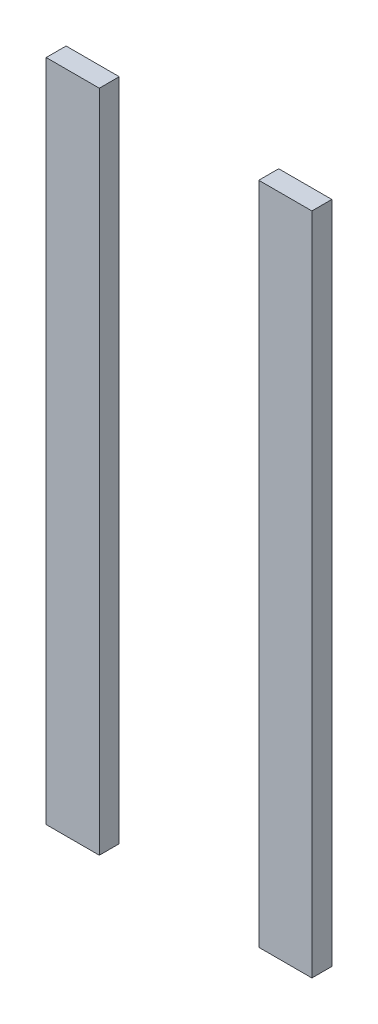
ISO-10303-21;
HEADER;
FILE_DESCRIPTION(('STEP AP214'),'2;1');
FILE_NAME('part.step','',(''),(''),'','','');
FILE_SCHEMA(('AUTOMOTIVE_DESIGN { 1 0 10303 214 1 1 1 1 }'));
ENDSEC;
DATA;
#1=APPLICATION_CONTEXT('core data for automotive mechanical design processes');
#2=APPLICATION_PROTOCOL_DEFINITION('international standard','automotive_design',2000,#1);
#3=PRODUCT_CONTEXT('',#1,'mechanical');
#4=PRODUCT('Part','Part','',(#3));
#5=PRODUCT_RELATED_PRODUCT_CATEGORY('part','',(#4));
#6=PRODUCT_DEFINITION_FORMATION('','',#4);
#7=PRODUCT_DEFINITION_CONTEXT('part definition',#1,'design');
#8=PRODUCT_DEFINITION('design','',#6,#7);
#9=PRODUCT_DEFINITION_SHAPE('','',#8);
#10=(LENGTH_UNIT() NAMED_UNIT(*) SI_UNIT(.MILLI.,.METRE.));
#11=(NAMED_UNIT(*) PLANE_ANGLE_UNIT() SI_UNIT($,.RADIAN.));
#12=(NAMED_UNIT(*) SI_UNIT($,.STERADIAN.) SOLID_ANGLE_UNIT());
#13=UNCERTAINTY_MEASURE_WITH_UNIT(LENGTH_MEASURE(1.E-05),#10,'distance_accuracy_value','');
#14=(GEOMETRIC_REPRESENTATION_CONTEXT(3) GLOBAL_UNCERTAINTY_ASSIGNED_CONTEXT((#13)) GLOBAL_UNIT_ASSIGNED_CONTEXT((#10,
#11,#12)) REPRESENTATION_CONTEXT('',''));
#15=CARTESIAN_POINT('',(0.,0.,0.));
#16=DIRECTION('',(0.,0.,1.));
#17=DIRECTION('',(1.,0.,0.));
#18=AXIS2_PLACEMENT_3D('',#15,#16,#17);
#19=CARTESIAN_POINT('',(0.,119.000004090112,0.));
#20=DIRECTION('',(0.,1.,0.));
#21=DIRECTION('',(0.,0.,-1.));
#22=AXIS2_PLACEMENT_3D('',#19,#20,#21);
#23=PLANE('',#22);
#24=DIRECTION('',(1.,0.,0.));
#25=VECTOR('',#24,1.);
#26=CARTESIAN_POINT('',(-20.,119.000004090112,-1.5));
#27=LINE('',#26,#25);
#28=CARTESIAN_POINT('',(-20.,119.000004090112,-1.5));
#29=VERTEX_POINT('',#28);
#30=CARTESIAN_POINT('',(-12.,119.000004090112,-1.5));
#31=VERTEX_POINT('',#30);
#32=EDGE_CURVE('E127',#29,#31,#27,.T.);
#33=ORIENTED_EDGE('',*,*,#32,.T.);
#34=DIRECTION('',(0.,0.,1.));
#35=VECTOR('',#34,1.);
#36=CARTESIAN_POINT('',(-12.,119.000004090112,-8.49999999999999));
#37=LINE('',#36,#35);
#38=CARTESIAN_POINT('',(-12.,119.000004090112,1.50000000000001));
#39=VERTEX_POINT('',#38);
#40=EDGE_CURVE('E75',#31,#39,#37,.T.);
#41=ORIENTED_EDGE('',*,*,#40,.T.);
#42=DIRECTION('',(-1.,0.,0.));
#43=VECTOR('',#42,1.);
#44=CARTESIAN_POINT('',(20.,119.000004090112,1.5));
#45=LINE('',#44,#43);
#46=CARTESIAN_POINT('',(-20.,119.000004090112,1.5));
#47=VERTEX_POINT('',#46);
#48=EDGE_CURVE('E63',#39,#47,#45,.T.);
#49=ORIENTED_EDGE('',*,*,#48,.T.);
#50=DIRECTION('',(0.,0.,-1.));
#51=VECTOR('',#50,1.);
#52=CARTESIAN_POINT('',(-20.,119.000004090112,1.5));
#53=LINE('',#52,#51);
#54=EDGE_CURVE('E132',#47,#29,#53,.T.);
#55=ORIENTED_EDGE('',*,*,#54,.T.);
#56=EDGE_LOOP('',(#33,#41,#49,#55));
#57=FACE_BOUND('',#56,.T.);
#58=ADVANCED_FACE('F60',(#57),#23,.F.);
#59=CARTESIAN_POINT('',(0.,219.000011994922,0.));
#60=DIRECTION('',(0.,1.,0.));
#61=DIRECTION('',(0.,0.,-1.));
#62=AXIS2_PLACEMENT_3D('',#59,#60,#61);
#63=PLANE('',#62);
#64=DIRECTION('',(0.,0.,1.));
#65=VECTOR('',#64,1.);
#66=CARTESIAN_POINT('',(-12.,219.000011994922,-8.49999999999999));
#67=LINE('',#66,#65);
#68=CARTESIAN_POINT('',(-12.,219.000011994922,-1.50000000000001));
#69=VERTEX_POINT('',#68);
#70=CARTESIAN_POINT('',(-12.,219.000011994922,1.5));
#71=VERTEX_POINT('',#70);
#72=EDGE_CURVE('E69',#69,#71,#67,.T.);
#73=ORIENTED_EDGE('',*,*,#72,.F.);
#74=DIRECTION('',(-1.,0.,0.));
#75=VECTOR('',#74,1.);
#76=CARTESIAN_POINT('',(-20.,219.000011994922,-1.5));
#77=LINE('',#76,#75);
#78=CARTESIAN_POINT('',(-20.,219.000011994922,-1.5));
#79=VERTEX_POINT('',#78);
#80=EDGE_CURVE('E124',#69,#79,#77,.T.);
#81=ORIENTED_EDGE('',*,*,#80,.T.);
#82=DIRECTION('',(0.,0.,1.));
#83=VECTOR('',#82,1.);
#84=CARTESIAN_POINT('',(-20.,219.000011994922,1.5));
#85=LINE('',#84,#83);
#86=CARTESIAN_POINT('',(-20.,219.000011994922,1.5));
#87=VERTEX_POINT('',#86);
#88=EDGE_CURVE('E114',#79,#87,#85,.T.);
#89=ORIENTED_EDGE('',*,*,#88,.T.);
#90=DIRECTION('',(1.,0.,0.));
#91=VECTOR('',#90,1.);
#92=CARTESIAN_POINT('',(20.,219.000011994922,1.5));
#93=LINE('',#92,#91);
#94=EDGE_CURVE('E111',#87,#71,#93,.T.);
#95=ORIENTED_EDGE('',*,*,#94,.T.);
#96=EDGE_LOOP('',(#73,#81,#89,#95));
#97=FACE_BOUND('',#96,.T.);
#98=ADVANCED_FACE('F112',(#97),#63,.T.);
#99=CARTESIAN_POINT('',(20.,119.000004090112,-1.5));
#100=DIRECTION('',(0.,0.,-1.));
#101=DIRECTION('',(0.,-1.,0.));
#102=AXIS2_PLACEMENT_3D('',#99,#100,#101);
#103=PLANE('',#102);
#104=DIRECTION('',(0.,1.,0.));
#105=VECTOR('',#104,1.);
#106=CARTESIAN_POINT('',(-12.,119.000004090112,-1.5));
#107=LINE('',#106,#105);
#108=EDGE_CURVE('E101',#31,#69,#107,.T.);
#109=ORIENTED_EDGE('',*,*,#108,.F.);
#110=ORIENTED_EDGE('',*,*,#32,.F.);
#111=DIRECTION('',(0.,1.,0.));
#112=VECTOR('',#111,1.);
#113=CARTESIAN_POINT('',(-20.,119.000004090112,-1.5));
#114=LINE('',#113,#112);
#115=EDGE_CURVE('E117',#29,#79,#114,.T.);
#116=ORIENTED_EDGE('',*,*,#115,.T.);
#117=ORIENTED_EDGE('',*,*,#80,.F.);
#118=EDGE_LOOP('',(#109,#110,#116,#117));
#119=FACE_BOUND('',#118,.T.);
#120=ADVANCED_FACE('F175',(#119),#103,.T.);
#121=CARTESIAN_POINT('',(-20.,119.000004090112,1.5));
#122=DIRECTION('',(0.,0.,1.));
#123=DIRECTION('',(0.,-1.,0.));
#124=AXIS2_PLACEMENT_3D('',#121,#122,#123);
#125=PLANE('',#124);
#126=DIRECTION('',(0.,-1.,0.));
#127=VECTOR('',#126,1.);
#128=CARTESIAN_POINT('',(-12.,119.000004090112,1.50000000000001));
#129=LINE('',#128,#127);
#130=EDGE_CURVE('E12',#71,#39,#129,.T.);
#131=ORIENTED_EDGE('',*,*,#130,.F.);
#132=ORIENTED_EDGE('',*,*,#94,.F.);
#133=DIRECTION('',(0.,1.,0.));
#134=VECTOR('',#133,1.);
#135=CARTESIAN_POINT('',(-20.,119.000004090112,1.5));
#136=LINE('',#135,#134);
#137=EDGE_CURVE('E122',#47,#87,#136,.T.);
#138=ORIENTED_EDGE('',*,*,#137,.F.);
#139=ORIENTED_EDGE('',*,*,#48,.F.);
#140=EDGE_LOOP('',(#131,#132,#138,#139));
#141=FACE_BOUND('',#140,.T.);
#142=ADVANCED_FACE('F109',(#141),#125,.T.);
#143=CARTESIAN_POINT('',(-20.,119.000004090112,-1.5));
#144=DIRECTION('',(-1.,0.,0.));
#145=DIRECTION('',(0.,1.,0.));
#146=AXIS2_PLACEMENT_3D('',#143,#144,#145);
#147=PLANE('',#146);
#148=ORIENTED_EDGE('',*,*,#54,.F.);
#149=ORIENTED_EDGE('',*,*,#137,.T.);
#150=ORIENTED_EDGE('',*,*,#88,.F.);
#151=ORIENTED_EDGE('',*,*,#115,.F.);
#152=EDGE_LOOP('',(#148,#149,#150,#151));
#153=FACE_BOUND('',#152,.T.);
#154=ADVANCED_FACE('F143',(#153),#147,.T.);
#155=CARTESIAN_POINT('',(-12.,119.000004090112,-8.49999999999999));
#156=DIRECTION('',(-1.,0.,0.));
#157=DIRECTION('',(0.,0.,1.));
#158=AXIS2_PLACEMENT_3D('',#155,#156,#157);
#159=PLANE('',#158);
#160=ORIENTED_EDGE('',*,*,#108,.T.);
#161=ORIENTED_EDGE('',*,*,#72,.T.);
#162=ORIENTED_EDGE('',*,*,#130,.T.);
#163=ORIENTED_EDGE('',*,*,#40,.F.);
#164=EDGE_LOOP('',(#160,#161,#162,#163));
#165=FACE_BOUND('',#164,.T.);
#166=ADVANCED_FACE('F100',(#165),#159,.F.);
#167=CLOSED_SHELL('',(#58,#98,#120,#142,#154,#166));
#168=MANIFOLD_SOLID_BREP('B2',#167);
#169=CARTESIAN_POINT('',(20.,119.000004090112,1.5));
#170=DIRECTION('',(1.,0.,0.));
#171=DIRECTION('',(0.,0.,-1.));
#172=AXIS2_PLACEMENT_3D('',#169,#170,#171);
#173=PLANE('',#172);
#174=DIRECTION('',(0.,0.,1.));
#175=VECTOR('',#174,1.);
#176=CARTESIAN_POINT('',(20.,119.000004090112,-1.5));
#177=LINE('',#176,#175);
#178=CARTESIAN_POINT('',(20.,119.000004090112,-1.5));
#179=VERTEX_POINT('',#178);
#180=CARTESIAN_POINT('',(20.,119.000004090112,1.5));
#181=VERTEX_POINT('',#180);
#182=EDGE_CURVE('E300',#179,#181,#177,.T.);
#183=ORIENTED_EDGE('',*,*,#182,.F.);
#184=DIRECTION('',(0.,1.,0.));
#185=VECTOR('',#184,1.);
#186=CARTESIAN_POINT('',(20.,119.000004090112,-1.5));
#187=LINE('',#186,#185);
#188=CARTESIAN_POINT('',(20.,219.000011994922,-1.5));
#189=VERTEX_POINT('',#188);
#190=EDGE_CURVE('E304',#179,#189,#187,.T.);
#191=ORIENTED_EDGE('',*,*,#190,.T.);
#192=DIRECTION('',(0.,0.,-1.));
#193=VECTOR('',#192,1.);
#194=CARTESIAN_POINT('',(20.,219.000011994922,-1.5));
#195=LINE('',#194,#193);
#196=CARTESIAN_POINT('',(20.,219.000011994922,1.5));
#197=VERTEX_POINT('',#196);
#198=EDGE_CURVE('E307',#197,#189,#195,.T.);
#199=ORIENTED_EDGE('',*,*,#198,.F.);
#200=DIRECTION('',(0.,1.,0.));
#201=VECTOR('',#200,1.);
#202=CARTESIAN_POINT('',(20.,119.000004090112,1.5));
#203=LINE('',#202,#201);
#204=EDGE_CURVE('E288',#181,#197,#203,.T.);
#205=ORIENTED_EDGE('',*,*,#204,.F.);
#206=EDGE_LOOP('',(#183,#191,#199,#205));
#207=FACE_BOUND('',#206,.T.);
#208=ADVANCED_FACE('F229',(#207),#173,.T.);
#209=CARTESIAN_POINT('',(20.,119.000004090112,-1.5));
#210=DIRECTION('',(0.,0.,-1.));
#211=DIRECTION('',(0.,-1.,0.));
#212=AXIS2_PLACEMENT_3D('',#209,#210,#211);
#213=PLANE('',#212);
#214=DIRECTION('',(0.,-1.,0.));
#215=VECTOR('',#214,1.);
#216=CARTESIAN_POINT('',(12.,119.000004090112,-1.5));
#217=LINE('',#216,#215);
#218=CARTESIAN_POINT('',(12.,219.000011994922,-1.5));
#219=VERTEX_POINT('',#218);
#220=CARTESIAN_POINT('',(12.,119.000004090112,-1.5));
#221=VERTEX_POINT('',#220);
#222=EDGE_CURVE('E284',#219,#221,#217,.T.);
#223=ORIENTED_EDGE('',*,*,#222,.F.);
#224=DIRECTION('',(-1.,0.,0.));
#225=VECTOR('',#224,1.);
#226=CARTESIAN_POINT('',(-20.,219.000011994922,-1.5));
#227=LINE('',#226,#225);
#228=EDGE_CURVE('E58',#189,#219,#227,.T.);
#229=ORIENTED_EDGE('',*,*,#228,.F.);
#230=ORIENTED_EDGE('',*,*,#190,.F.);
#231=DIRECTION('',(1.,0.,0.));
#232=VECTOR('',#231,1.);
#233=CARTESIAN_POINT('',(-20.,119.000004090112,-1.5));
#234=LINE('',#233,#232);
#235=EDGE_CURVE('E233',#221,#179,#234,.T.);
#236=ORIENTED_EDGE('',*,*,#235,.F.);
#237=EDGE_LOOP('',(#223,#229,#230,#236));
#238=FACE_BOUND('',#237,.T.);
#239=ADVANCED_FACE('F318',(#238),#213,.T.);
#240=CARTESIAN_POINT('',(-20.,119.000004090112,1.5));
#241=DIRECTION('',(0.,0.,1.));
#242=DIRECTION('',(0.,-1.,0.));
#243=AXIS2_PLACEMENT_3D('',#240,#241,#242);
#244=PLANE('',#243);
#245=DIRECTION('',(0.,1.,0.));
#246=VECTOR('',#245,1.);
#247=CARTESIAN_POINT('',(12.,119.000004090112,1.50000000000001));
#248=LINE('',#247,#246);
#249=CARTESIAN_POINT('',(12.,119.000004090112,1.5));
#250=VERTEX_POINT('',#249);
#251=CARTESIAN_POINT('',(12.,219.000011994922,1.50000000000001));
#252=VERTEX_POINT('',#251);
#253=EDGE_CURVE('E276',#250,#252,#248,.T.);
#254=ORIENTED_EDGE('',*,*,#253,.F.);
#255=DIRECTION('',(-1.,0.,0.));
#256=VECTOR('',#255,1.);
#257=CARTESIAN_POINT('',(20.,119.000004090112,1.5));
#258=LINE('',#257,#256);
#259=EDGE_CURVE('E291',#181,#250,#258,.T.);
#260=ORIENTED_EDGE('',*,*,#259,.F.);
#261=ORIENTED_EDGE('',*,*,#204,.T.);
#262=DIRECTION('',(1.,0.,0.));
#263=VECTOR('',#262,1.);
#264=CARTESIAN_POINT('',(20.,219.000011994922,1.5));
#265=LINE('',#264,#263);
#266=EDGE_CURVE('E257',#252,#197,#265,.T.);
#267=ORIENTED_EDGE('',*,*,#266,.F.);
#268=EDGE_LOOP('',(#254,#260,#261,#267));
#269=FACE_BOUND('',#268,.T.);
#270=ADVANCED_FACE('F286',(#269),#244,.T.);
#271=CARTESIAN_POINT('',(0.,219.000011994922,0.));
#272=DIRECTION('',(0.,1.,0.));
#273=DIRECTION('',(0.,0.,-1.));
#274=AXIS2_PLACEMENT_3D('',#271,#272,#273);
#275=PLANE('',#274);
#276=DIRECTION('',(0.,0.,1.));
#277=VECTOR('',#276,1.);
#278=CARTESIAN_POINT('',(12.,219.000011994922,-8.49999999999999));
#279=LINE('',#278,#277);
#280=EDGE_CURVE('E278',#219,#252,#279,.T.);
#281=ORIENTED_EDGE('',*,*,#280,.T.);
#282=ORIENTED_EDGE('',*,*,#266,.T.);
#283=ORIENTED_EDGE('',*,*,#198,.T.);
#284=ORIENTED_EDGE('',*,*,#228,.T.);
#285=EDGE_LOOP('',(#281,#282,#283,#284));
#286=FACE_BOUND('',#285,.T.);
#287=ADVANCED_FACE('F283',(#286),#275,.T.);
#288=CARTESIAN_POINT('',(0.,119.000004090112,0.));
#289=DIRECTION('',(0.,1.,0.));
#290=DIRECTION('',(0.,0.,-1.));
#291=AXIS2_PLACEMENT_3D('',#288,#289,#290);
#292=PLANE('',#291);
#293=ORIENTED_EDGE('',*,*,#259,.T.);
#294=DIRECTION('',(0.,0.,1.));
#295=VECTOR('',#294,1.);
#296=CARTESIAN_POINT('',(12.,119.000004090112,-8.49999999999999));
#297=LINE('',#296,#295);
#298=EDGE_CURVE('E245',#221,#250,#297,.T.);
#299=ORIENTED_EDGE('',*,*,#298,.F.);
#300=ORIENTED_EDGE('',*,*,#235,.T.);
#301=ORIENTED_EDGE('',*,*,#182,.T.);
#302=EDGE_LOOP('',(#293,#299,#300,#301));
#303=FACE_BOUND('',#302,.T.);
#304=ADVANCED_FACE('F231',(#303),#292,.F.);
#305=CARTESIAN_POINT('',(12.,119.000004090112,-8.49999999999999));
#306=DIRECTION('',(1.,0.,0.));
#307=DIRECTION('',(0.,0.,-1.));
#308=AXIS2_PLACEMENT_3D('',#305,#306,#307);
#309=PLANE('',#308);
#310=ORIENTED_EDGE('',*,*,#222,.T.);
#311=ORIENTED_EDGE('',*,*,#298,.T.);
#312=ORIENTED_EDGE('',*,*,#253,.T.);
#313=ORIENTED_EDGE('',*,*,#280,.F.);
#314=EDGE_LOOP('',(#310,#311,#312,#313));
#315=FACE_BOUND('',#314,.T.);
#316=ADVANCED_FACE('F277',(#315),#309,.F.);
#317=CLOSED_SHELL('',(#208,#239,#270,#287,#304,#316));
#318=MANIFOLD_SOLID_BREP('B6',#317);
#319=ADVANCED_BREP_SHAPE_REPRESENTATION('',(#18,#168,#318),#14);
#320=SHAPE_DEFINITION_REPRESENTATION(#9,#319);
ENDSEC;
END-ISO-10303-21;
